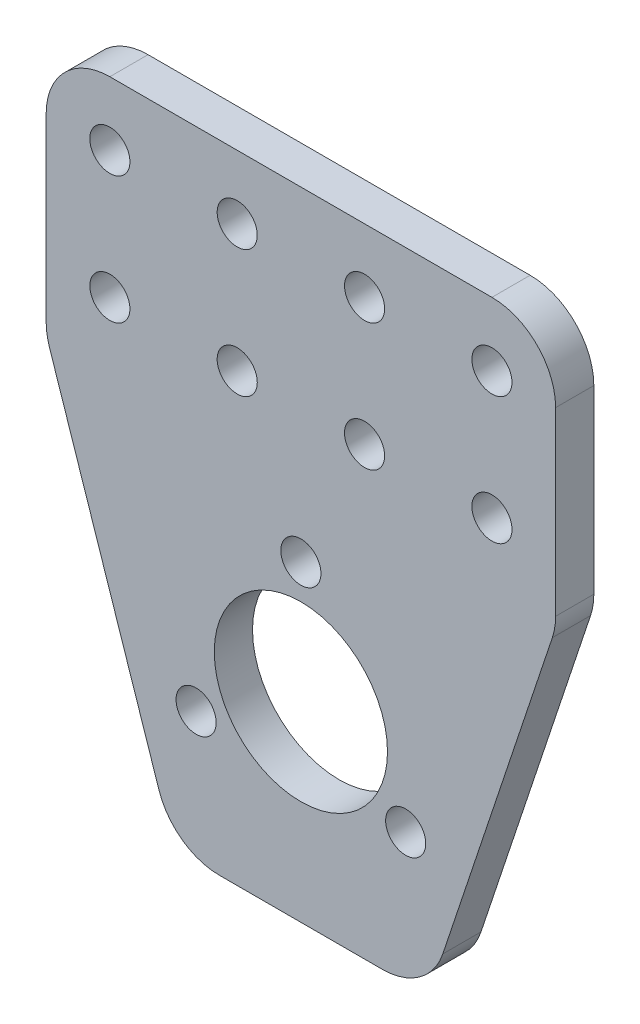
ISO-10303-21;
HEADER;
FILE_DESCRIPTION(('STEP AP214'),'2;1');
FILE_NAME('part.step','',(''),(''),'','','');
FILE_SCHEMA(('AUTOMOTIVE_DESIGN { 1 0 10303 214 1 1 1 1 }'));
ENDSEC;
DATA;
#1=APPLICATION_CONTEXT('core data for automotive mechanical design processes');
#2=APPLICATION_PROTOCOL_DEFINITION('international standard','automotive_design',2000,#1);
#3=PRODUCT_CONTEXT('',#1,'mechanical');
#4=PRODUCT('Part','Part','',(#3));
#5=PRODUCT_RELATED_PRODUCT_CATEGORY('part','',(#4));
#6=PRODUCT_DEFINITION_FORMATION('','',#4);
#7=PRODUCT_DEFINITION_CONTEXT('part definition',#1,'design');
#8=PRODUCT_DEFINITION('design','',#6,#7);
#9=PRODUCT_DEFINITION_SHAPE('','',#8);
#10=(LENGTH_UNIT() NAMED_UNIT(*) SI_UNIT(.MILLI.,.METRE.));
#11=(NAMED_UNIT(*) PLANE_ANGLE_UNIT() SI_UNIT($,.RADIAN.));
#12=(NAMED_UNIT(*) SI_UNIT($,.STERADIAN.) SOLID_ANGLE_UNIT());
#13=UNCERTAINTY_MEASURE_WITH_UNIT(LENGTH_MEASURE(1.E-05),#10,'distance_accuracy_value','');
#14=(GEOMETRIC_REPRESENTATION_CONTEXT(3) GLOBAL_UNCERTAINTY_ASSIGNED_CONTEXT((#13)) GLOBAL_UNIT_ASSIGNED_CONTEXT((#10,
#11,#12)) REPRESENTATION_CONTEXT('',''));
#15=CARTESIAN_POINT('',(0.,0.,0.));
#16=DIRECTION('',(0.,0.,1.));
#17=DIRECTION('',(1.,0.,0.));
#18=AXIS2_PLACEMENT_3D('',#15,#16,#17);
#19=CARTESIAN_POINT('',(40.,0.,3.));
#20=DIRECTION('',(0.,-1.,0.));
#21=DIRECTION('',(1.,0.,0.));
#22=AXIS2_PLACEMENT_3D('',#19,#20,#21);
#23=PLANE('',#22);
#24=DIRECTION('',(-1.,0.,0.));
#25=VECTOR('',#24,1.);
#26=CARTESIAN_POINT('',(40.,0.,3.));
#27=LINE('',#26,#25);
#28=CARTESIAN_POINT('',(35.,0.,3.));
#29=VERTEX_POINT('',#28);
#30=CARTESIAN_POINT('',(5.,0.,3.));
#31=VERTEX_POINT('',#30);
#32=EDGE_CURVE('E162',#29,#31,#27,.T.);
#33=ORIENTED_EDGE('',*,*,#32,.F.);
#34=DIRECTION('',(0.,0.,-1.));
#35=VECTOR('',#34,1.);
#36=CARTESIAN_POINT('',(35.,0.,3.));
#37=LINE('',#36,#35);
#38=CARTESIAN_POINT('',(35.,0.,0.));
#39=VERTEX_POINT('',#38);
#40=EDGE_CURVE('E11',#29,#39,#37,.T.);
#41=ORIENTED_EDGE('',*,*,#40,.T.);
#42=DIRECTION('',(-1.,0.,0.));
#43=VECTOR('',#42,1.);
#44=CARTESIAN_POINT('',(40.,0.,0.));
#45=LINE('',#44,#43);
#46=CARTESIAN_POINT('',(5.,0.,0.));
#47=VERTEX_POINT('',#46);
#48=EDGE_CURVE('E211',#39,#47,#45,.T.);
#49=ORIENTED_EDGE('',*,*,#48,.T.);
#50=DIRECTION('',(0.,0.,-1.));
#51=VECTOR('',#50,1.);
#52=CARTESIAN_POINT('',(5.,0.,3.));
#53=LINE('',#52,#51);
#54=EDGE_CURVE('E50',#47,#31,#53,.F.);
#55=ORIENTED_EDGE('',*,*,#54,.T.);
#56=EDGE_LOOP('',(#33,#41,#49,#55));
#57=FACE_BOUND('',#56,.T.);
#58=ADVANCED_FACE('F42',(#57),#23,.F.);
#59=CARTESIAN_POINT('',(0.,0.,3.));
#60=DIRECTION('',(1.,0.,0.));
#61=DIRECTION('',(0.,1.,0.));
#62=AXIS2_PLACEMENT_3D('',#59,#60,#61);
#63=PLANE('',#62);
#64=DIRECTION('',(0.,-1.,0.));
#65=VECTOR('',#64,1.);
#66=CARTESIAN_POINT('',(0.,0.,0.));
#67=LINE('',#66,#65);
#68=CARTESIAN_POINT('',(0.,-5.,0.));
#69=VERTEX_POINT('',#68);
#70=CARTESIAN_POINT('',(0.,-19.1886116991581,0.));
#71=VERTEX_POINT('',#70);
#72=EDGE_CURVE('E226',#69,#71,#67,.T.);
#73=ORIENTED_EDGE('',*,*,#72,.T.);
#74=DIRECTION('',(0.,0.,-1.));
#75=VECTOR('',#74,1.);
#76=CARTESIAN_POINT('',(0.,-19.1886116991581,3.));
#77=LINE('',#76,#75);
#78=CARTESIAN_POINT('',(0.,-19.1886116991581,3.));
#79=VERTEX_POINT('',#78);
#80=EDGE_CURVE('E199',#71,#79,#77,.F.);
#81=ORIENTED_EDGE('',*,*,#80,.T.);
#82=DIRECTION('',(0.,-1.,0.));
#83=VECTOR('',#82,1.);
#84=CARTESIAN_POINT('',(0.,0.,3.));
#85=LINE('',#84,#83);
#86=CARTESIAN_POINT('',(0.,-5.,3.));
#87=VERTEX_POINT('',#86);
#88=EDGE_CURVE('E219',#87,#79,#85,.T.);
#89=ORIENTED_EDGE('',*,*,#88,.F.);
#90=DIRECTION('',(0.,0.,-1.));
#91=VECTOR('',#90,1.);
#92=CARTESIAN_POINT('',(0.,-5.,3.));
#93=LINE('',#92,#91);
#94=EDGE_CURVE('E196',#87,#69,#93,.T.);
#95=ORIENTED_EDGE('',*,*,#94,.T.);
#96=EDGE_LOOP('',(#73,#81,#89,#95));
#97=FACE_BOUND('',#96,.T.);
#98=ADVANCED_FACE('F225',(#97),#63,.F.);
#99=CARTESIAN_POINT('',(0.,-20.,3.));
#100=DIRECTION('',(0.948683298050514,0.316227766016838,0.));
#101=DIRECTION('',(-0.316227766016838,0.948683298050514,0.));
#102=AXIS2_PLACEMENT_3D('',#99,#100,#101);
#103=PLANE('',#102);
#104=DIRECTION('',(0.316227766016838,-0.948683298050514,0.));
#105=VECTOR('',#104,1.);
#106=CARTESIAN_POINT('',(0.,-20.,0.));
#107=LINE('',#106,#105);
#108=CARTESIAN_POINT('',(0.256583509747433,-20.7697505292423,0.));
#109=VERTEX_POINT('',#108);
#110=CARTESIAN_POINT('',(8.86037961002807,-46.5811388300842,0.));
#111=VERTEX_POINT('',#110);
#112=EDGE_CURVE('E164',#109,#111,#107,.T.);
#113=ORIENTED_EDGE('',*,*,#112,.T.);
#114=DIRECTION('',(0.,0.,-1.));
#115=VECTOR('',#114,1.);
#116=CARTESIAN_POINT('',(8.86037961002807,-46.5811388300842,3.));
#117=LINE('',#116,#115);
#118=CARTESIAN_POINT('',(8.86037961002807,-46.5811388300842,3.));
#119=VERTEX_POINT('',#118);
#120=EDGE_CURVE('E194',#111,#119,#117,.F.);
#121=ORIENTED_EDGE('',*,*,#120,.T.);
#122=DIRECTION('',(0.316227766016838,-0.948683298050514,0.));
#123=VECTOR('',#122,1.);
#124=CARTESIAN_POINT('',(0.,-20.,3.));
#125=LINE('',#124,#123);
#126=CARTESIAN_POINT('',(0.256583509747433,-20.7697505292423,3.));
#127=VERTEX_POINT('',#126);
#128=EDGE_CURVE('E238',#127,#119,#125,.T.);
#129=ORIENTED_EDGE('',*,*,#128,.F.);
#130=DIRECTION('',(0.,0.,-1.));
#131=VECTOR('',#130,1.);
#132=CARTESIAN_POINT('',(0.256583509747433,-20.7697505292423,3.));
#133=LINE('',#132,#131);
#134=EDGE_CURVE('E191',#127,#109,#133,.T.);
#135=ORIENTED_EDGE('',*,*,#134,.T.);
#136=EDGE_LOOP('',(#113,#121,#129,#135));
#137=FACE_BOUND('',#136,.T.);
#138=ADVANCED_FACE('F350',(#137),#103,.F.);
#139=CARTESIAN_POINT('',(30.,-50.,3.));
#140=DIRECTION('',(0.,1.,0.));
#141=DIRECTION('',(0.,0.,1.));
#142=AXIS2_PLACEMENT_3D('',#139,#140,#141);
#143=PLANE('',#142);
#144=DIRECTION('',(1.,0.,0.));
#145=VECTOR('',#144,1.);
#146=CARTESIAN_POINT('',(30.,-50.,0.));
#147=LINE('',#146,#145);
#148=CARTESIAN_POINT('',(13.6037961002806,-50.,0.));
#149=VERTEX_POINT('',#148);
#150=CARTESIAN_POINT('',(26.3962038997194,-50.,0.));
#151=VERTEX_POINT('',#150);
#152=EDGE_CURVE('E160',#149,#151,#147,.T.);
#153=ORIENTED_EDGE('',*,*,#152,.T.);
#154=DIRECTION('',(0.,0.,-1.));
#155=VECTOR('',#154,1.);
#156=CARTESIAN_POINT('',(26.3962038997194,-50.,3.));
#157=LINE('',#156,#155);
#158=CARTESIAN_POINT('',(26.3962038997194,-50.,3.));
#159=VERTEX_POINT('',#158);
#160=EDGE_CURVE('E138',#151,#159,#157,.F.);
#161=ORIENTED_EDGE('',*,*,#160,.T.);
#162=DIRECTION('',(1.,0.,0.));
#163=VECTOR('',#162,1.);
#164=CARTESIAN_POINT('',(30.,-50.,3.));
#165=LINE('',#164,#163);
#166=CARTESIAN_POINT('',(13.6037961002806,-50.,3.));
#167=VERTEX_POINT('',#166);
#168=EDGE_CURVE('E236',#167,#159,#165,.T.);
#169=ORIENTED_EDGE('',*,*,#168,.F.);
#170=DIRECTION('',(0.,0.,-1.));
#171=VECTOR('',#170,1.);
#172=CARTESIAN_POINT('',(13.6037961002806,-50.,3.));
#173=LINE('',#172,#171);
#174=EDGE_CURVE('E143',#167,#149,#173,.T.);
#175=ORIENTED_EDGE('',*,*,#174,.T.);
#176=EDGE_LOOP('',(#153,#161,#169,#175));
#177=FACE_BOUND('',#176,.T.);
#178=ADVANCED_FACE('F379',(#177),#143,.F.);
#179=CARTESIAN_POINT('',(40.,-20.,3.));
#180=DIRECTION('',(-0.948683298050514,0.316227766016838,0.));
#181=DIRECTION('',(-0.316227766016838,-0.948683298050514,0.));
#182=AXIS2_PLACEMENT_3D('',#179,#180,#181);
#183=PLANE('',#182);
#184=DIRECTION('',(0.316227766016838,0.948683298050514,0.));
#185=VECTOR('',#184,1.);
#186=CARTESIAN_POINT('',(40.,-20.,3.));
#187=LINE('',#186,#185);
#188=CARTESIAN_POINT('',(31.1396203899719,-46.5811388300842,3.));
#189=VERTEX_POINT('',#188);
#190=CARTESIAN_POINT('',(39.7434164902526,-20.7697505292423,3.));
#191=VERTEX_POINT('',#190);
#192=EDGE_CURVE('E152',#189,#191,#187,.T.);
#193=ORIENTED_EDGE('',*,*,#192,.F.);
#194=DIRECTION('',(0.,0.,-1.));
#195=VECTOR('',#194,1.);
#196=CARTESIAN_POINT('',(31.1396203899719,-46.5811388300842,3.));
#197=LINE('',#196,#195);
#198=CARTESIAN_POINT('',(31.1396203899719,-46.5811388300842,0.));
#199=VERTEX_POINT('',#198);
#200=EDGE_CURVE('E137',#189,#199,#197,.T.);
#201=ORIENTED_EDGE('',*,*,#200,.T.);
#202=DIRECTION('',(0.316227766016838,0.948683298050514,0.));
#203=VECTOR('',#202,1.);
#204=CARTESIAN_POINT('',(40.,-20.,0.));
#205=LINE('',#204,#203);
#206=CARTESIAN_POINT('',(39.7434164902526,-20.7697505292423,0.));
#207=VERTEX_POINT('',#206);
#208=EDGE_CURVE('E150',#199,#207,#205,.T.);
#209=ORIENTED_EDGE('',*,*,#208,.T.);
#210=DIRECTION('',(0.,0.,-1.));
#211=VECTOR('',#210,1.);
#212=CARTESIAN_POINT('',(39.7434164902526,-20.7697505292423,3.));
#213=LINE('',#212,#211);
#214=EDGE_CURVE('E154',#207,#191,#213,.F.);
#215=ORIENTED_EDGE('',*,*,#214,.T.);
#216=EDGE_LOOP('',(#193,#201,#209,#215));
#217=FACE_BOUND('',#216,.T.);
#218=ADVANCED_FACE('F149',(#217),#183,.F.);
#219=CARTESIAN_POINT('',(40.,-20.,3.));
#220=DIRECTION('',(-1.,0.,0.));
#221=DIRECTION('',(0.,0.,1.));
#222=AXIS2_PLACEMENT_3D('',#219,#220,#221);
#223=PLANE('',#222);
#224=DIRECTION('',(0.,1.,0.));
#225=VECTOR('',#224,1.);
#226=CARTESIAN_POINT('',(40.,-20.,3.));
#227=LINE('',#226,#225);
#228=CARTESIAN_POINT('',(40.,-19.1886116991581,3.));
#229=VERTEX_POINT('',#228);
#230=CARTESIAN_POINT('',(40.,-5.,3.));
#231=VERTEX_POINT('',#230);
#232=EDGE_CURVE('E168',#229,#231,#227,.T.);
#233=ORIENTED_EDGE('',*,*,#232,.F.);
#234=DIRECTION('',(0.,0.,-1.));
#235=VECTOR('',#234,1.);
#236=CARTESIAN_POINT('',(40.,-19.1886116991581,3.));
#237=LINE('',#236,#235);
#238=CARTESIAN_POINT('',(40.,-19.1886116991581,0.));
#239=VERTEX_POINT('',#238);
#240=EDGE_CURVE('E202',#229,#239,#237,.T.);
#241=ORIENTED_EDGE('',*,*,#240,.T.);
#242=DIRECTION('',(0.,1.,0.));
#243=VECTOR('',#242,1.);
#244=CARTESIAN_POINT('',(40.,-20.,0.));
#245=LINE('',#244,#243);
#246=CARTESIAN_POINT('',(40.,-5.,0.));
#247=VERTEX_POINT('',#246);
#248=EDGE_CURVE('E159',#239,#247,#245,.T.);
#249=ORIENTED_EDGE('',*,*,#248,.T.);
#250=DIRECTION('',(0.,0.,-1.));
#251=VECTOR('',#250,1.);
#252=CARTESIAN_POINT('',(40.,-5.,3.));
#253=LINE('',#252,#251);
#254=EDGE_CURVE('E57',#247,#231,#253,.F.);
#255=ORIENTED_EDGE('',*,*,#254,.T.);
#256=EDGE_LOOP('',(#233,#241,#249,#255));
#257=FACE_BOUND('',#256,.T.);
#258=ADVANCED_FACE('F318',(#257),#223,.F.);
#259=CARTESIAN_POINT('',(0.,0.,3.));
#260=DIRECTION('',(0.,0.,1.));
#261=DIRECTION('',(1.,0.,0.));
#262=AXIS2_PLACEMENT_3D('',#259,#260,#261);
#263=PLANE('',#262);
#264=CARTESIAN_POINT('',(28.2272413359525,-39.7499999999998,3.));
#265=DIRECTION('',(0.,0.,1.));
#266=DIRECTION('',(1.,0.,0.));
#267=AXIS2_PLACEMENT_3D('',#264,#265,#266);
#268=CIRCLE('',#267,1.575);
#269=CARTESIAN_POINT('',(29.8022413359525,-39.7499999999998,3.));
#270=VERTEX_POINT('',#269);
#271=EDGE_CURVE('E252',#270,#270,#268,.T.);
#272=ORIENTED_EDGE('',*,*,#271,.F.);
#273=EDGE_LOOP('',(#272));
#274=FACE_BOUND('',#273,.T.);
#275=CARTESIAN_POINT('',(20.,-35.,3.));
#276=DIRECTION('',(0.,0.,1.));
#277=DIRECTION('',(1.,0.,0.));
#278=AXIS2_PLACEMENT_3D('',#275,#276,#277);
#279=CIRCLE('',#278,6.8);
#280=CARTESIAN_POINT('',(26.8,-35.,3.));
#281=VERTEX_POINT('',#280);
#282=EDGE_CURVE('E251',#281,#281,#279,.T.);
#283=ORIENTED_EDGE('',*,*,#282,.F.);
#284=EDGE_LOOP('',(#283));
#285=FACE_BOUND('',#284,.T.);
#286=CARTESIAN_POINT('',(11.7727586640482,-39.7500000000002,3.));
#287=DIRECTION('',(0.,0.,1.));
#288=DIRECTION('',(1.,0.,0.));
#289=AXIS2_PLACEMENT_3D('',#286,#287,#288);
#290=CIRCLE('',#289,1.575);
#291=CARTESIAN_POINT('',(13.3477586640482,-39.7500000000002,3.));
#292=VERTEX_POINT('',#291);
#293=EDGE_CURVE('E259',#292,#292,#290,.T.);
#294=ORIENTED_EDGE('',*,*,#293,.F.);
#295=EDGE_LOOP('',(#294));
#296=FACE_BOUND('',#295,.T.);
#297=CARTESIAN_POINT('',(35.,-15.,3.));
#298=DIRECTION('',(0.,0.,1.));
#299=DIRECTION('',(1.,0.,0.));
#300=AXIS2_PLACEMENT_3D('',#297,#298,#299);
#301=CIRCLE('',#300,1.575);
#302=CARTESIAN_POINT('',(36.575,-15.,3.));
#303=VERTEX_POINT('',#302);
#304=EDGE_CURVE('E282',#303,#303,#301,.T.);
#305=ORIENTED_EDGE('',*,*,#304,.F.);
#306=EDGE_LOOP('',(#305));
#307=FACE_BOUND('',#306,.T.);
#308=CARTESIAN_POINT('',(5.,-15.,3.));
#309=DIRECTION('',(0.,0.,1.));
#310=DIRECTION('',(-1.,0.,0.));
#311=AXIS2_PLACEMENT_3D('',#308,#309,#310);
#312=CIRCLE('',#311,1.575);
#313=CARTESIAN_POINT('',(3.425,-15.,3.));
#314=VERTEX_POINT('',#313);
#315=EDGE_CURVE('E271',#314,#314,#312,.T.);
#316=ORIENTED_EDGE('',*,*,#315,.F.);
#317=EDGE_LOOP('',(#316));
#318=FACE_BOUND('',#317,.T.);
#319=CARTESIAN_POINT('',(15.,-15.,3.));
#320=DIRECTION('',(0.,0.,1.));
#321=DIRECTION('',(1.,0.,0.));
#322=AXIS2_PLACEMENT_3D('',#319,#320,#321);
#323=CIRCLE('',#322,1.575);
#324=CARTESIAN_POINT('',(16.575,-15.,3.));
#325=VERTEX_POINT('',#324);
#326=EDGE_CURVE('E270',#325,#325,#323,.T.);
#327=ORIENTED_EDGE('',*,*,#326,.F.);
#328=EDGE_LOOP('',(#327));
#329=FACE_BOUND('',#328,.T.);
#330=CARTESIAN_POINT('',(15.,-4.99999999999999,3.));
#331=DIRECTION('',(0.,0.,1.));
#332=DIRECTION('',(-1.,0.,0.));
#333=AXIS2_PLACEMENT_3D('',#330,#331,#332);
#334=CIRCLE('',#333,1.575);
#335=CARTESIAN_POINT('',(13.425,-4.99999999999999,3.));
#336=VERTEX_POINT('',#335);
#337=EDGE_CURVE('E245',#336,#336,#334,.T.);
#338=ORIENTED_EDGE('',*,*,#337,.F.);
#339=EDGE_LOOP('',(#338));
#340=FACE_BOUND('',#339,.T.);
#341=CARTESIAN_POINT('',(20.,-25.5,3.));
#342=DIRECTION('',(0.,0.,1.));
#343=DIRECTION('',(1.,0.,0.));
#344=AXIS2_PLACEMENT_3D('',#341,#342,#343);
#345=CIRCLE('',#344,1.575);
#346=CARTESIAN_POINT('',(21.575,-25.5,3.));
#347=VERTEX_POINT('',#346);
#348=EDGE_CURVE('E305',#347,#347,#345,.T.);
#349=ORIENTED_EDGE('',*,*,#348,.F.);
#350=EDGE_LOOP('',(#349));
#351=FACE_BOUND('',#350,.T.);
#352=CARTESIAN_POINT('',(35.,-4.99999999999998,3.));
#353=DIRECTION('',(0.,0.,1.));
#354=DIRECTION('',(-1.,0.,0.));
#355=AXIS2_PLACEMENT_3D('',#352,#353,#354);
#356=CIRCLE('',#355,1.575);
#357=CARTESIAN_POINT('',(33.425,-4.99999999999998,3.));
#358=VERTEX_POINT('',#357);
#359=EDGE_CURVE('E295',#358,#358,#356,.T.);
#360=ORIENTED_EDGE('',*,*,#359,.F.);
#361=EDGE_LOOP('',(#360));
#362=FACE_BOUND('',#361,.T.);
#363=CARTESIAN_POINT('',(25.,-4.99999999999999,3.));
#364=DIRECTION('',(0.,0.,1.));
#365=DIRECTION('',(1.,0.,0.));
#366=AXIS2_PLACEMENT_3D('',#363,#364,#365);
#367=CIRCLE('',#366,1.575);
#368=CARTESIAN_POINT('',(26.575,-4.99999999999999,3.));
#369=VERTEX_POINT('',#368);
#370=EDGE_CURVE('E294',#369,#369,#367,.T.);
#371=ORIENTED_EDGE('',*,*,#370,.F.);
#372=EDGE_LOOP('',(#371));
#373=FACE_BOUND('',#372,.T.);
#374=CARTESIAN_POINT('',(25.,-15.,3.));
#375=DIRECTION('',(0.,0.,1.));
#376=DIRECTION('',(-1.,0.,0.));
#377=AXIS2_PLACEMENT_3D('',#374,#375,#376);
#378=CIRCLE('',#377,1.575);
#379=CARTESIAN_POINT('',(23.425,-15.,3.));
#380=VERTEX_POINT('',#379);
#381=EDGE_CURVE('E283',#380,#380,#378,.T.);
#382=ORIENTED_EDGE('',*,*,#381,.F.);
#383=EDGE_LOOP('',(#382));
#384=FACE_BOUND('',#383,.T.);
#385=CARTESIAN_POINT('',(5.,-4.99999999999999,3.));
#386=DIRECTION('',(0.,0.,1.));
#387=DIRECTION('',(1.,0.,0.));
#388=AXIS2_PLACEMENT_3D('',#385,#386,#387);
#389=CIRCLE('',#388,1.575);
#390=CARTESIAN_POINT('',(6.575,-4.99999999999999,3.));
#391=VERTEX_POINT('',#390);
#392=EDGE_CURVE('E242',#391,#391,#389,.T.);
#393=ORIENTED_EDGE('',*,*,#392,.F.);
#394=EDGE_LOOP('',(#393));
#395=FACE_BOUND('',#394,.T.);
#396=ORIENTED_EDGE('',*,*,#168,.T.);
#397=CARTESIAN_POINT('',(26.3962038997194,-45.,3.));
#398=DIRECTION('',(0.,0.,1.));
#399=DIRECTION('',(1.,0.,0.));
#400=AXIS2_PLACEMENT_3D('',#397,#398,#399);
#401=CIRCLE('',#400,5.);
#402=EDGE_CURVE('E189',#159,#189,#401,.T.);
#403=ORIENTED_EDGE('',*,*,#402,.T.);
#404=ORIENTED_EDGE('',*,*,#192,.T.);
#405=CARTESIAN_POINT('',(35.,-19.1886116991581,3.));
#406=DIRECTION('',(0.,0.,1.));
#407=DIRECTION('',(1.,0.,0.));
#408=AXIS2_PLACEMENT_3D('',#405,#406,#407);
#409=CIRCLE('',#408,5.);
#410=EDGE_CURVE('E64',#191,#229,#409,.T.);
#411=ORIENTED_EDGE('',*,*,#410,.T.);
#412=ORIENTED_EDGE('',*,*,#232,.T.);
#413=CARTESIAN_POINT('',(35.,-5.,3.));
#414=DIRECTION('',(0.,0.,1.));
#415=DIRECTION('',(1.,0.,0.));
#416=AXIS2_PLACEMENT_3D('',#413,#414,#415);
#417=CIRCLE('',#416,5.);
#418=EDGE_CURVE('E182',#231,#29,#417,.T.);
#419=ORIENTED_EDGE('',*,*,#418,.T.);
#420=ORIENTED_EDGE('',*,*,#32,.T.);
#421=CARTESIAN_POINT('',(5.,-5.,3.));
#422=DIRECTION('',(0.,0.,1.));
#423=DIRECTION('',(1.,0.,0.));
#424=AXIS2_PLACEMENT_3D('',#421,#422,#423);
#425=CIRCLE('',#424,5.);
#426=EDGE_CURVE('E180',#31,#87,#425,.T.);
#427=ORIENTED_EDGE('',*,*,#426,.T.);
#428=ORIENTED_EDGE('',*,*,#88,.T.);
#429=CARTESIAN_POINT('',(5.,-19.1886116991581,3.));
#430=DIRECTION('',(0.,0.,1.));
#431=DIRECTION('',(1.,0.,0.));
#432=AXIS2_PLACEMENT_3D('',#429,#430,#431);
#433=CIRCLE('',#432,5.);
#434=EDGE_CURVE('E185',#79,#127,#433,.T.);
#435=ORIENTED_EDGE('',*,*,#434,.T.);
#436=ORIENTED_EDGE('',*,*,#128,.T.);
#437=CARTESIAN_POINT('',(13.6037961002806,-45.,3.));
#438=DIRECTION('',(0.,0.,1.));
#439=DIRECTION('',(1.,0.,0.));
#440=AXIS2_PLACEMENT_3D('',#437,#438,#439);
#441=CIRCLE('',#440,5.);
#442=EDGE_CURVE('E187',#119,#167,#441,.T.);
#443=ORIENTED_EDGE('',*,*,#442,.T.);
#444=EDGE_LOOP('',(#396,#403,#404,#411,#412,#419,#420,#427,#428,#435,#436,#443));
#445=FACE_BOUND('',#444,.T.);
#446=ADVANCED_FACE('F215',(#274,#285,#296,#307,#318,#329,#340,#351,#362,#373,#384,#395,#445),
#263,.T.);
#447=CARTESIAN_POINT('',(0.,0.,0.));
#448=DIRECTION('',(0.,0.,1.));
#449=DIRECTION('',(1.,0.,0.));
#450=AXIS2_PLACEMENT_3D('',#447,#448,#449);
#451=PLANE('',#450);
#452=CARTESIAN_POINT('',(28.2272413359525,-39.7499999999998,0.));
#453=DIRECTION('',(0.,0.,1.));
#454=DIRECTION('',(1.,0.,0.));
#455=AXIS2_PLACEMENT_3D('',#452,#453,#454);
#456=CIRCLE('',#455,1.575);
#457=CARTESIAN_POINT('',(29.8022413359525,-39.7499999999998,0.));
#458=VERTEX_POINT('',#457);
#459=EDGE_CURVE('E256',#458,#458,#456,.T.);
#460=ORIENTED_EDGE('',*,*,#459,.T.);
#461=EDGE_LOOP('',(#460));
#462=FACE_BOUND('',#461,.T.);
#463=CARTESIAN_POINT('',(20.,-35.,0.));
#464=DIRECTION('',(0.,0.,1.));
#465=DIRECTION('',(1.,0.,0.));
#466=AXIS2_PLACEMENT_3D('',#463,#464,#465);
#467=CIRCLE('',#466,6.8);
#468=CARTESIAN_POINT('',(26.8,-35.,0.));
#469=VERTEX_POINT('',#468);
#470=EDGE_CURVE('E248',#469,#469,#467,.T.);
#471=ORIENTED_EDGE('',*,*,#470,.T.);
#472=EDGE_LOOP('',(#471));
#473=FACE_BOUND('',#472,.T.);
#474=CARTESIAN_POINT('',(11.7727586640482,-39.7500000000002,0.));
#475=DIRECTION('',(0.,0.,1.));
#476=DIRECTION('',(1.,0.,0.));
#477=AXIS2_PLACEMENT_3D('',#474,#475,#476);
#478=CIRCLE('',#477,1.575);
#479=CARTESIAN_POINT('',(13.3477586640482,-39.7500000000002,0.));
#480=VERTEX_POINT('',#479);
#481=EDGE_CURVE('E262',#480,#480,#478,.T.);
#482=ORIENTED_EDGE('',*,*,#481,.T.);
#483=EDGE_LOOP('',(#482));
#484=FACE_BOUND('',#483,.T.);
#485=CARTESIAN_POINT('',(35.,-15.,0.));
#486=DIRECTION('',(0.,0.,1.));
#487=DIRECTION('',(1.,0.,0.));
#488=AXIS2_PLACEMENT_3D('',#485,#486,#487);
#489=CIRCLE('',#488,1.575);
#490=CARTESIAN_POINT('',(36.575,-15.,0.));
#491=VERTEX_POINT('',#490);
#492=EDGE_CURVE('E279',#491,#491,#489,.T.);
#493=ORIENTED_EDGE('',*,*,#492,.T.);
#494=EDGE_LOOP('',(#493));
#495=FACE_BOUND('',#494,.T.);
#496=CARTESIAN_POINT('',(5.,-15.,0.));
#497=DIRECTION('',(0.,0.,1.));
#498=DIRECTION('',(-1.,0.,0.));
#499=AXIS2_PLACEMENT_3D('',#496,#497,#498);
#500=CIRCLE('',#499,1.575);
#501=CARTESIAN_POINT('',(3.425,-15.,0.));
#502=VERTEX_POINT('',#501);
#503=EDGE_CURVE('E286',#502,#502,#500,.T.);
#504=ORIENTED_EDGE('',*,*,#503,.T.);
#505=EDGE_LOOP('',(#504));
#506=FACE_BOUND('',#505,.T.);
#507=CARTESIAN_POINT('',(15.,-15.,0.));
#508=DIRECTION('',(0.,0.,1.));
#509=DIRECTION('',(1.,0.,0.));
#510=AXIS2_PLACEMENT_3D('',#507,#508,#509);
#511=CIRCLE('',#510,1.575);
#512=CARTESIAN_POINT('',(16.575,-15.,0.));
#513=VERTEX_POINT('',#512);
#514=EDGE_CURVE('E267',#513,#513,#511,.T.);
#515=ORIENTED_EDGE('',*,*,#514,.T.);
#516=EDGE_LOOP('',(#515));
#517=FACE_BOUND('',#516,.T.);
#518=CARTESIAN_POINT('',(15.,-4.99999999999999,0.));
#519=DIRECTION('',(0.,0.,1.));
#520=DIRECTION('',(-1.,0.,0.));
#521=AXIS2_PLACEMENT_3D('',#518,#519,#520);
#522=CIRCLE('',#521,1.575);
#523=CARTESIAN_POINT('',(13.425,-4.99999999999999,0.));
#524=VERTEX_POINT('',#523);
#525=EDGE_CURVE('E274',#524,#524,#522,.T.);
#526=ORIENTED_EDGE('',*,*,#525,.T.);
#527=EDGE_LOOP('',(#526));
#528=FACE_BOUND('',#527,.T.);
#529=CARTESIAN_POINT('',(20.,-25.5,0.));
#530=DIRECTION('',(0.,0.,1.));
#531=DIRECTION('',(1.,0.,0.));
#532=AXIS2_PLACEMENT_3D('',#529,#530,#531);
#533=CIRCLE('',#532,1.575);
#534=CARTESIAN_POINT('',(21.575,-25.5,0.));
#535=VERTEX_POINT('',#534);
#536=EDGE_CURVE('E255',#535,#535,#533,.T.);
#537=ORIENTED_EDGE('',*,*,#536,.T.);
#538=EDGE_LOOP('',(#537));
#539=FACE_BOUND('',#538,.T.);
#540=CARTESIAN_POINT('',(35.,-4.99999999999998,0.));
#541=DIRECTION('',(0.,0.,1.));
#542=DIRECTION('',(-1.,0.,0.));
#543=AXIS2_PLACEMENT_3D('',#540,#541,#542);
#544=CIRCLE('',#543,1.575);
#545=CARTESIAN_POINT('',(33.425,-4.99999999999998,0.));
#546=VERTEX_POINT('',#545);
#547=EDGE_CURVE('E308',#546,#546,#544,.T.);
#548=ORIENTED_EDGE('',*,*,#547,.T.);
#549=EDGE_LOOP('',(#548));
#550=FACE_BOUND('',#549,.T.);
#551=CARTESIAN_POINT('',(25.,-4.99999999999999,0.));
#552=DIRECTION('',(0.,0.,1.));
#553=DIRECTION('',(1.,0.,0.));
#554=AXIS2_PLACEMENT_3D('',#551,#552,#553);
#555=CIRCLE('',#554,1.575);
#556=CARTESIAN_POINT('',(26.575,-4.99999999999999,0.));
#557=VERTEX_POINT('',#556);
#558=EDGE_CURVE('E291',#557,#557,#555,.T.);
#559=ORIENTED_EDGE('',*,*,#558,.T.);
#560=EDGE_LOOP('',(#559));
#561=FACE_BOUND('',#560,.T.);
#562=CARTESIAN_POINT('',(25.,-15.,0.));
#563=DIRECTION('',(0.,0.,1.));
#564=DIRECTION('',(-1.,0.,0.));
#565=AXIS2_PLACEMENT_3D('',#562,#563,#564);
#566=CIRCLE('',#565,1.575);
#567=CARTESIAN_POINT('',(23.425,-15.,0.));
#568=VERTEX_POINT('',#567);
#569=EDGE_CURVE('E298',#568,#568,#566,.T.);
#570=ORIENTED_EDGE('',*,*,#569,.T.);
#571=EDGE_LOOP('',(#570));
#572=FACE_BOUND('',#571,.T.);
#573=CARTESIAN_POINT('',(5.,-4.99999999999999,0.));
#574=DIRECTION('',(0.,0.,1.));
#575=DIRECTION('',(1.,0.,0.));
#576=AXIS2_PLACEMENT_3D('',#573,#574,#575);
#577=CIRCLE('',#576,1.575);
#578=CARTESIAN_POINT('',(6.575,-4.99999999999999,0.));
#579=VERTEX_POINT('',#578);
#580=EDGE_CURVE('E231',#579,#579,#577,.T.);
#581=ORIENTED_EDGE('',*,*,#580,.T.);
#582=EDGE_LOOP('',(#581));
#583=FACE_BOUND('',#582,.T.);
#584=ORIENTED_EDGE('',*,*,#208,.F.);
#585=CARTESIAN_POINT('',(26.3962038997194,-45.,0.));
#586=DIRECTION('',(0.,0.,1.));
#587=DIRECTION('',(1.,0.,0.));
#588=AXIS2_PLACEMENT_3D('',#585,#586,#587);
#589=CIRCLE('',#588,5.);
#590=EDGE_CURVE('E133',#199,#151,#589,.F.);
#591=ORIENTED_EDGE('',*,*,#590,.T.);
#592=ORIENTED_EDGE('',*,*,#152,.F.);
#593=CARTESIAN_POINT('',(13.6037961002806,-45.,0.));
#594=DIRECTION('',(0.,0.,1.));
#595=DIRECTION('',(1.,0.,0.));
#596=AXIS2_PLACEMENT_3D('',#593,#594,#595);
#597=CIRCLE('',#596,5.);
#598=EDGE_CURVE('E144',#149,#111,#597,.F.);
#599=ORIENTED_EDGE('',*,*,#598,.T.);
#600=ORIENTED_EDGE('',*,*,#112,.F.);
#601=CARTESIAN_POINT('',(5.,-19.1886116991581,0.));
#602=DIRECTION('',(0.,0.,1.));
#603=DIRECTION('',(1.,0.,0.));
#604=AXIS2_PLACEMENT_3D('',#601,#602,#603);
#605=CIRCLE('',#604,5.);
#606=EDGE_CURVE('E174',#109,#71,#605,.F.);
#607=ORIENTED_EDGE('',*,*,#606,.T.);
#608=ORIENTED_EDGE('',*,*,#72,.F.);
#609=CARTESIAN_POINT('',(5.,-5.,0.));
#610=DIRECTION('',(0.,0.,1.));
#611=DIRECTION('',(1.,0.,0.));
#612=AXIS2_PLACEMENT_3D('',#609,#610,#611);
#613=CIRCLE('',#612,5.);
#614=EDGE_CURVE('E153',#69,#47,#613,.F.);
#615=ORIENTED_EDGE('',*,*,#614,.T.);
#616=ORIENTED_EDGE('',*,*,#48,.F.);
#617=CARTESIAN_POINT('',(35.,-5.,0.));
#618=DIRECTION('',(0.,0.,1.));
#619=DIRECTION('',(1.,0.,0.));
#620=AXIS2_PLACEMENT_3D('',#617,#618,#619);
#621=CIRCLE('',#620,5.);
#622=EDGE_CURVE('E171',#39,#247,#621,.F.);
#623=ORIENTED_EDGE('',*,*,#622,.T.);
#624=ORIENTED_EDGE('',*,*,#248,.F.);
#625=CARTESIAN_POINT('',(35.,-19.1886116991581,0.));
#626=DIRECTION('',(0.,0.,1.));
#627=DIRECTION('',(1.,0.,0.));
#628=AXIS2_PLACEMENT_3D('',#625,#626,#627);
#629=CIRCLE('',#628,5.);
#630=EDGE_CURVE('E158',#239,#207,#629,.F.);
#631=ORIENTED_EDGE('',*,*,#630,.T.);
#632=EDGE_LOOP('',(#584,#591,#592,#599,#600,#607,#608,#615,#616,#623,#624,#631));
#633=FACE_BOUND('',#632,.T.);
#634=ADVANCED_FACE('F156',(#462,#473,#484,#495,#506,#517,#528,#539,#550,#561,#572,#583,#633),
#451,.F.);
#635=CARTESIAN_POINT('',(5.,-4.99999999999999,0.));
#636=DIRECTION('',(0.,0.,1.));
#637=DIRECTION('',(1.,0.,0.));
#638=AXIS2_PLACEMENT_3D('',#635,#636,#637);
#639=CYLINDRICAL_SURFACE('',#638,1.575);
#640=ORIENTED_EDGE('',*,*,#580,.F.);
#641=EDGE_LOOP('',(#640));
#642=FACE_BOUND('',#641,.T.);
#643=ORIENTED_EDGE('',*,*,#392,.T.);
#644=EDGE_LOOP('',(#643));
#645=FACE_BOUND('',#644,.T.);
#646=ADVANCED_FACE('F327',(#642,#645),#639,.F.);
#647=CARTESIAN_POINT('',(25.,-15.,0.));
#648=DIRECTION('',(0.,0.,1.));
#649=DIRECTION('',(1.,0.,0.));
#650=AXIS2_PLACEMENT_3D('',#647,#648,#649);
#651=CYLINDRICAL_SURFACE('',#650,1.575);
#652=ORIENTED_EDGE('',*,*,#569,.F.);
#653=EDGE_LOOP('',(#652));
#654=FACE_BOUND('',#653,.T.);
#655=ORIENTED_EDGE('',*,*,#381,.T.);
#656=EDGE_LOOP('',(#655));
#657=FACE_BOUND('',#656,.T.);
#658=ADVANCED_FACE('F329',(#654,#657),#651,.F.);
#659=CARTESIAN_POINT('',(25.,-4.99999999999999,0.));
#660=DIRECTION('',(0.,0.,1.));
#661=DIRECTION('',(1.,0.,0.));
#662=AXIS2_PLACEMENT_3D('',#659,#660,#661);
#663=CYLINDRICAL_SURFACE('',#662,1.575);
#664=ORIENTED_EDGE('',*,*,#558,.F.);
#665=EDGE_LOOP('',(#664));
#666=FACE_BOUND('',#665,.T.);
#667=ORIENTED_EDGE('',*,*,#370,.T.);
#668=EDGE_LOOP('',(#667));
#669=FACE_BOUND('',#668,.T.);
#670=ADVANCED_FACE('F336',(#666,#669),#663,.F.);
#671=CARTESIAN_POINT('',(35.,-4.99999999999998,0.));
#672=DIRECTION('',(0.,0.,1.));
#673=DIRECTION('',(1.,0.,0.));
#674=AXIS2_PLACEMENT_3D('',#671,#672,#673);
#675=CYLINDRICAL_SURFACE('',#674,1.575);
#676=ORIENTED_EDGE('',*,*,#547,.F.);
#677=EDGE_LOOP('',(#676));
#678=FACE_BOUND('',#677,.T.);
#679=ORIENTED_EDGE('',*,*,#359,.T.);
#680=EDGE_LOOP('',(#679));
#681=FACE_BOUND('',#680,.T.);
#682=ADVANCED_FACE('F314',(#678,#681),#675,.F.);
#683=CARTESIAN_POINT('',(20.,-25.5,0.));
#684=DIRECTION('',(0.,0.,1.));
#685=DIRECTION('',(1.,0.,0.));
#686=AXIS2_PLACEMENT_3D('',#683,#684,#685);
#687=CYLINDRICAL_SURFACE('',#686,1.575);
#688=ORIENTED_EDGE('',*,*,#536,.F.);
#689=EDGE_LOOP('',(#688));
#690=FACE_BOUND('',#689,.T.);
#691=ORIENTED_EDGE('',*,*,#348,.T.);
#692=EDGE_LOOP('',(#691));
#693=FACE_BOUND('',#692,.T.);
#694=ADVANCED_FACE('F516',(#690,#693),#687,.F.);
#695=CARTESIAN_POINT('',(15.,-4.99999999999999,0.));
#696=DIRECTION('',(0.,0.,1.));
#697=DIRECTION('',(1.,0.,0.));
#698=AXIS2_PLACEMENT_3D('',#695,#696,#697);
#699=CYLINDRICAL_SURFACE('',#698,1.575);
#700=ORIENTED_EDGE('',*,*,#525,.F.);
#701=EDGE_LOOP('',(#700));
#702=FACE_BOUND('',#701,.T.);
#703=ORIENTED_EDGE('',*,*,#337,.T.);
#704=EDGE_LOOP('',(#703));
#705=FACE_BOUND('',#704,.T.);
#706=ADVANCED_FACE('F506',(#702,#705),#699,.F.);
#707=CARTESIAN_POINT('',(15.,-15.,0.));
#708=DIRECTION('',(0.,0.,1.));
#709=DIRECTION('',(1.,0.,0.));
#710=AXIS2_PLACEMENT_3D('',#707,#708,#709);
#711=CYLINDRICAL_SURFACE('',#710,1.575);
#712=ORIENTED_EDGE('',*,*,#514,.F.);
#713=EDGE_LOOP('',(#712));
#714=FACE_BOUND('',#713,.T.);
#715=ORIENTED_EDGE('',*,*,#326,.T.);
#716=EDGE_LOOP('',(#715));
#717=FACE_BOUND('',#716,.T.);
#718=ADVANCED_FACE('F496',(#714,#717),#711,.F.);
#719=CARTESIAN_POINT('',(5.,-15.,0.));
#720=DIRECTION('',(0.,0.,1.));
#721=DIRECTION('',(1.,0.,0.));
#722=AXIS2_PLACEMENT_3D('',#719,#720,#721);
#723=CYLINDRICAL_SURFACE('',#722,1.575);
#724=ORIENTED_EDGE('',*,*,#503,.F.);
#725=EDGE_LOOP('',(#724));
#726=FACE_BOUND('',#725,.T.);
#727=ORIENTED_EDGE('',*,*,#315,.T.);
#728=EDGE_LOOP('',(#727));
#729=FACE_BOUND('',#728,.T.);
#730=ADVANCED_FACE('F486',(#726,#729),#723,.F.);
#731=CARTESIAN_POINT('',(35.,-15.,0.));
#732=DIRECTION('',(0.,0.,1.));
#733=DIRECTION('',(1.,0.,0.));
#734=AXIS2_PLACEMENT_3D('',#731,#732,#733);
#735=CYLINDRICAL_SURFACE('',#734,1.575);
#736=ORIENTED_EDGE('',*,*,#492,.F.);
#737=EDGE_LOOP('',(#736));
#738=FACE_BOUND('',#737,.T.);
#739=ORIENTED_EDGE('',*,*,#304,.T.);
#740=EDGE_LOOP('',(#739));
#741=FACE_BOUND('',#740,.T.);
#742=ADVANCED_FACE('F476',(#738,#741),#735,.F.);
#743=CARTESIAN_POINT('',(11.7727586640482,-39.7500000000002,0.));
#744=DIRECTION('',(0.,0.,1.));
#745=DIRECTION('',(1.,0.,0.));
#746=AXIS2_PLACEMENT_3D('',#743,#744,#745);
#747=CYLINDRICAL_SURFACE('',#746,1.575);
#748=ORIENTED_EDGE('',*,*,#481,.F.);
#749=EDGE_LOOP('',(#748));
#750=FACE_BOUND('',#749,.T.);
#751=ORIENTED_EDGE('',*,*,#293,.T.);
#752=EDGE_LOOP('',(#751));
#753=FACE_BOUND('',#752,.T.);
#754=ADVANCED_FACE('F467',(#750,#753),#747,.F.);
#755=CARTESIAN_POINT('',(20.,-35.,0.));
#756=DIRECTION('',(0.,0.,1.));
#757=DIRECTION('',(1.,0.,0.));
#758=AXIS2_PLACEMENT_3D('',#755,#756,#757);
#759=CYLINDRICAL_SURFACE('',#758,6.8);
#760=ORIENTED_EDGE('',*,*,#470,.F.);
#761=EDGE_LOOP('',(#760));
#762=FACE_BOUND('',#761,.T.);
#763=ORIENTED_EDGE('',*,*,#282,.T.);
#764=EDGE_LOOP('',(#763));
#765=FACE_BOUND('',#764,.T.);
#766=ADVANCED_FACE('F458',(#762,#765),#759,.F.);
#767=CARTESIAN_POINT('',(28.2272413359525,-39.7499999999998,0.));
#768=DIRECTION('',(0.,0.,1.));
#769=DIRECTION('',(1.,0.,0.));
#770=AXIS2_PLACEMENT_3D('',#767,#768,#769);
#771=CYLINDRICAL_SURFACE('',#770,1.575);
#772=ORIENTED_EDGE('',*,*,#459,.F.);
#773=EDGE_LOOP('',(#772));
#774=FACE_BOUND('',#773,.T.);
#775=ORIENTED_EDGE('',*,*,#271,.T.);
#776=EDGE_LOOP('',(#775));
#777=FACE_BOUND('',#776,.T.);
#778=ADVANCED_FACE('F357',(#774,#777),#771,.F.);
#779=CARTESIAN_POINT('',(26.3962038997194,-45.,3.));
#780=DIRECTION('',(0.,0.,-1.));
#781=DIRECTION('',(-1.,0.,0.));
#782=AXIS2_PLACEMENT_3D('',#779,#780,#781);
#783=CYLINDRICAL_SURFACE('',#782,5.);
#784=ORIENTED_EDGE('',*,*,#402,.F.);
#785=ORIENTED_EDGE('',*,*,#160,.F.);
#786=ORIENTED_EDGE('',*,*,#590,.F.);
#787=ORIENTED_EDGE('',*,*,#200,.F.);
#788=EDGE_LOOP('',(#784,#785,#786,#787));
#789=FACE_BOUND('',#788,.T.);
#790=ADVANCED_FACE('F136',(#789),#783,.T.);
#791=CARTESIAN_POINT('',(13.6037961002806,-45.,3.));
#792=DIRECTION('',(0.,0.,-1.));
#793=DIRECTION('',(-1.,0.,0.));
#794=AXIS2_PLACEMENT_3D('',#791,#792,#793);
#795=CYLINDRICAL_SURFACE('',#794,5.);
#796=ORIENTED_EDGE('',*,*,#442,.F.);
#797=ORIENTED_EDGE('',*,*,#120,.F.);
#798=ORIENTED_EDGE('',*,*,#598,.F.);
#799=ORIENTED_EDGE('',*,*,#174,.F.);
#800=EDGE_LOOP('',(#796,#797,#798,#799));
#801=FACE_BOUND('',#800,.T.);
#802=ADVANCED_FACE('F356',(#801),#795,.T.);
#803=CARTESIAN_POINT('',(5.,-19.1886116991581,3.));
#804=DIRECTION('',(0.,0.,-1.));
#805=DIRECTION('',(-1.,0.,0.));
#806=AXIS2_PLACEMENT_3D('',#803,#804,#805);
#807=CYLINDRICAL_SURFACE('',#806,5.);
#808=ORIENTED_EDGE('',*,*,#434,.F.);
#809=ORIENTED_EDGE('',*,*,#80,.F.);
#810=ORIENTED_EDGE('',*,*,#606,.F.);
#811=ORIENTED_EDGE('',*,*,#134,.F.);
#812=EDGE_LOOP('',(#808,#809,#810,#811));
#813=FACE_BOUND('',#812,.T.);
#814=ADVANCED_FACE('F360',(#813),#807,.T.);
#815=CARTESIAN_POINT('',(35.,-19.1886116991581,3.));
#816=DIRECTION('',(0.,0.,-1.));
#817=DIRECTION('',(-1.,0.,0.));
#818=AXIS2_PLACEMENT_3D('',#815,#816,#817);
#819=CYLINDRICAL_SURFACE('',#818,5.);
#820=ORIENTED_EDGE('',*,*,#410,.F.);
#821=ORIENTED_EDGE('',*,*,#214,.F.);
#822=ORIENTED_EDGE('',*,*,#630,.F.);
#823=ORIENTED_EDGE('',*,*,#240,.F.);
#824=EDGE_LOOP('',(#820,#821,#822,#823));
#825=FACE_BOUND('',#824,.T.);
#826=ADVANCED_FACE('F364',(#825),#819,.T.);
#827=CARTESIAN_POINT('',(35.,-5.,3.));
#828=DIRECTION('',(0.,0.,-1.));
#829=DIRECTION('',(-1.,0.,0.));
#830=AXIS2_PLACEMENT_3D('',#827,#828,#829);
#831=CYLINDRICAL_SURFACE('',#830,5.);
#832=ORIENTED_EDGE('',*,*,#418,.F.);
#833=ORIENTED_EDGE('',*,*,#254,.F.);
#834=ORIENTED_EDGE('',*,*,#622,.F.);
#835=ORIENTED_EDGE('',*,*,#40,.F.);
#836=EDGE_LOOP('',(#832,#833,#834,#835));
#837=FACE_BOUND('',#836,.T.);
#838=ADVANCED_FACE('F367',(#837),#831,.T.);
#839=CARTESIAN_POINT('',(5.,-5.,3.));
#840=DIRECTION('',(0.,0.,-1.));
#841=DIRECTION('',(-1.,0.,0.));
#842=AXIS2_PLACEMENT_3D('',#839,#840,#841);
#843=CYLINDRICAL_SURFACE('',#842,5.);
#844=ORIENTED_EDGE('',*,*,#426,.F.);
#845=ORIENTED_EDGE('',*,*,#54,.F.);
#846=ORIENTED_EDGE('',*,*,#614,.F.);
#847=ORIENTED_EDGE('',*,*,#94,.F.);
#848=EDGE_LOOP('',(#844,#845,#846,#847));
#849=FACE_BOUND('',#848,.T.);
#850=ADVANCED_FACE('F44',(#849),#843,.T.);
#851=CLOSED_SHELL('',(#58,#98,#138,#178,#218,#258,#446,#634,#646,#658,#670,#682,#694,#706,#718,
#730,#742,#754,#766,#778,#790,#802,#814,#826,#838,#850));
#852=MANIFOLD_SOLID_BREP('B2',#851);
#853=ADVANCED_BREP_SHAPE_REPRESENTATION('',(#18,#852),#14);
#854=SHAPE_DEFINITION_REPRESENTATION(#9,#853);
ENDSEC;
END-ISO-10303-21;
